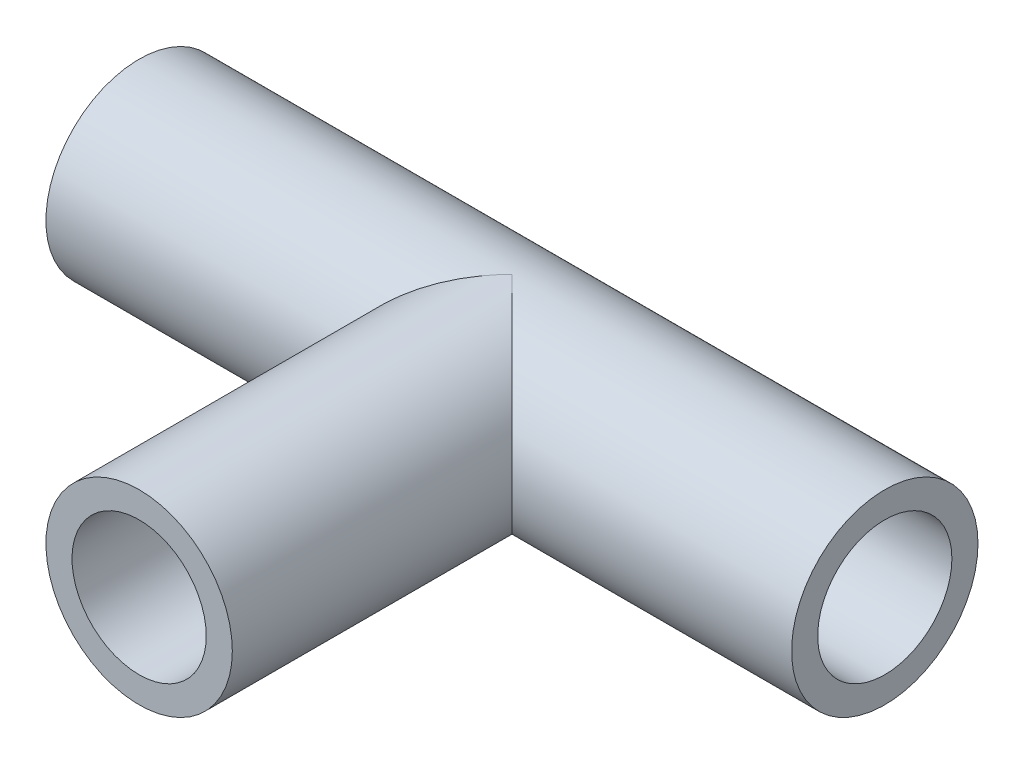
ISO-10303-21;
HEADER;
FILE_DESCRIPTION(('STEP AP214'),'2;1');
FILE_NAME('part.step','',(''),(''),'','','');
FILE_SCHEMA(('AUTOMOTIVE_DESIGN { 1 0 10303 214 1 1 1 1 }'));
ENDSEC;
DATA;
#1=APPLICATION_CONTEXT('core data for automotive mechanical design processes');
#2=APPLICATION_PROTOCOL_DEFINITION('international standard','automotive_design',2000,#1);
#3=PRODUCT_CONTEXT('',#1,'mechanical');
#4=PRODUCT('Part','Part','',(#3));
#5=PRODUCT_RELATED_PRODUCT_CATEGORY('part','',(#4));
#6=PRODUCT_DEFINITION_FORMATION('','',#4);
#7=PRODUCT_DEFINITION_CONTEXT('part definition',#1,'design');
#8=PRODUCT_DEFINITION('design','',#6,#7);
#9=PRODUCT_DEFINITION_SHAPE('','',#8);
#10=(LENGTH_UNIT() NAMED_UNIT(*) SI_UNIT(.MILLI.,.METRE.));
#11=(NAMED_UNIT(*) PLANE_ANGLE_UNIT() SI_UNIT($,.RADIAN.));
#12=(NAMED_UNIT(*) SI_UNIT($,.STERADIAN.) SOLID_ANGLE_UNIT());
#13=UNCERTAINTY_MEASURE_WITH_UNIT(LENGTH_MEASURE(1.E-05),#10,'distance_accuracy_value','');
#14=(GEOMETRIC_REPRESENTATION_CONTEXT(3) GLOBAL_UNCERTAINTY_ASSIGNED_CONTEXT((#13)) GLOBAL_UNIT_ASSIGNED_CONTEXT((#10,
#11,#12)) REPRESENTATION_CONTEXT('',''));
#15=CARTESIAN_POINT('',(0.,0.,0.));
#16=DIRECTION('',(0.,0.,1.));
#17=DIRECTION('',(1.,0.,0.));
#18=AXIS2_PLACEMENT_3D('',#15,#16,#17);
#19=CARTESIAN_POINT('',(0.,0.,0.));
#20=DIRECTION('',(1.,0.,0.));
#21=DIRECTION('',(0.,0.,-1.));
#22=AXIS2_PLACEMENT_3D('',#19,#20,#21);
#23=CYLINDRICAL_SURFACE('',#22,2.7);
#24=CARTESIAN_POINT('',(30.,0.,0.));
#25=DIRECTION('',(1.,0.,0.));
#26=DIRECTION('',(0.,0.,-1.));
#27=AXIS2_PLACEMENT_3D('',#24,#25,#26);
#28=CIRCLE('',#27,2.7);
#29=CARTESIAN_POINT('',(30.,0.,-2.7));
#30=VERTEX_POINT('',#29);
#31=EDGE_CURVE('E103',#30,#30,#28,.T.);
#32=ORIENTED_EDGE('',*,*,#31,.T.);
#33=EDGE_LOOP('',(#32));
#34=FACE_BOUND('',#33,.T.);
#35=CARTESIAN_POINT('',(0.,0.,0.));
#36=DIRECTION('',(1.,0.,0.));
#37=DIRECTION('',(0.,0.,-1.));
#38=AXIS2_PLACEMENT_3D('',#35,#36,#37);
#39=CIRCLE('',#38,2.7);
#40=CARTESIAN_POINT('',(0.,0.,-2.7));
#41=VERTEX_POINT('',#40);
#42=EDGE_CURVE('E96',#41,#41,#39,.T.);
#43=ORIENTED_EDGE('',*,*,#42,.F.);
#44=EDGE_LOOP('',(#43));
#45=FACE_BOUND('',#44,.T.);
#46=CARTESIAN_POINT('',(15.,0.,0.));
#47=DIRECTION('',(0.707106781186547,0.,-0.707106781186547));
#48=DIRECTION('',(0.707106781186547,0.,0.707106781186547));
#49=AXIS2_PLACEMENT_3D('',#46,#47,#48);
#50=ELLIPSE('',#49,3.81837661840736,2.7);
#51=CARTESIAN_POINT('',(15.,2.7,0.));
#52=VERTEX_POINT('',#51);
#53=CARTESIAN_POINT('',(15.,-2.7,0.));
#54=VERTEX_POINT('',#53);
#55=EDGE_CURVE('E12',#52,#54,#50,.T.);
#56=ORIENTED_EDGE('',*,*,#55,.F.);
#57=CARTESIAN_POINT('',(15.,0.,0.));
#58=DIRECTION('',(0.707106781186547,0.,0.707106781186547));
#59=DIRECTION('',(0.707106781186547,0.,-0.707106781186547));
#60=AXIS2_PLACEMENT_3D('',#57,#58,#59);
#61=ELLIPSE('',#60,3.81837661840736,2.7);
#62=EDGE_CURVE('E51',#54,#52,#61,.F.);
#63=ORIENTED_EDGE('',*,*,#62,.F.);
#64=EDGE_LOOP('',(#56,#63));
#65=FACE_BOUND('',#64,.T.);
#66=ADVANCED_FACE('F43',(#34,#45,#65),#23,.F.);
#67=CARTESIAN_POINT('',(30.,0.,0.));
#68=DIRECTION('',(-1.,0.,0.));
#69=DIRECTION('',(0.,0.,1.));
#70=AXIS2_PLACEMENT_3D('',#67,#68,#69);
#71=CYLINDRICAL_SURFACE('',#70,3.75);
#72=CARTESIAN_POINT('',(0.,0.,0.));
#73=DIRECTION('',(1.,0.,0.));
#74=DIRECTION('',(0.,0.,-1.));
#75=AXIS2_PLACEMENT_3D('',#72,#73,#74);
#76=CIRCLE('',#75,3.75);
#77=CARTESIAN_POINT('',(0.,0.,-3.75));
#78=VERTEX_POINT('',#77);
#79=EDGE_CURVE('E99',#78,#78,#76,.T.);
#80=ORIENTED_EDGE('',*,*,#79,.T.);
#81=EDGE_LOOP('',(#80));
#82=FACE_BOUND('',#81,.T.);
#83=CARTESIAN_POINT('',(30.,0.,0.));
#84=DIRECTION('',(1.,0.,0.));
#85=DIRECTION('',(0.,0.,-1.));
#86=AXIS2_PLACEMENT_3D('',#83,#84,#85);
#87=CIRCLE('',#86,3.75);
#88=CARTESIAN_POINT('',(30.,0.,-3.75));
#89=VERTEX_POINT('',#88);
#90=EDGE_CURVE('E69',#89,#89,#87,.T.);
#91=ORIENTED_EDGE('',*,*,#90,.F.);
#92=EDGE_LOOP('',(#91));
#93=FACE_BOUND('',#92,.T.);
#94=CARTESIAN_POINT('',(15.,0.,0.));
#95=DIRECTION('',(-0.707106781186547,0.,-0.707106781186547));
#96=DIRECTION('',(-0.707106781186547,0.,0.707106781186547));
#97=AXIS2_PLACEMENT_3D('',#94,#95,#96);
#98=ELLIPSE('',#97,5.30330085889911,3.75);
#99=CARTESIAN_POINT('',(15.,3.75,0.));
#100=VERTEX_POINT('',#99);
#101=CARTESIAN_POINT('',(15.,-3.75,0.));
#102=VERTEX_POINT('',#101);
#103=EDGE_CURVE('E106',#100,#102,#98,.F.);
#104=ORIENTED_EDGE('',*,*,#103,.F.);
#105=CARTESIAN_POINT('',(15.,0.,0.));
#106=DIRECTION('',(-0.707106781186547,0.,0.707106781186547));
#107=DIRECTION('',(-0.707106781186547,0.,-0.707106781186547));
#108=AXIS2_PLACEMENT_3D('',#105,#106,#107);
#109=ELLIPSE('',#108,5.30330085889911,3.75);
#110=EDGE_CURVE('E62',#102,#100,#109,.T.);
#111=ORIENTED_EDGE('',*,*,#110,.F.);
#112=EDGE_LOOP('',(#104,#111));
#113=FACE_BOUND('',#112,.T.);
#114=ADVANCED_FACE('F45',(#82,#93,#113),#71,.T.);
#115=CARTESIAN_POINT('',(30.,0.,0.));
#116=DIRECTION('',(1.,0.,0.));
#117=DIRECTION('',(0.,0.,-1.));
#118=AXIS2_PLACEMENT_3D('',#115,#116,#117);
#119=PLANE('',#118);
#120=ORIENTED_EDGE('',*,*,#31,.F.);
#121=EDGE_LOOP('',(#120));
#122=FACE_BOUND('',#121,.T.);
#123=ORIENTED_EDGE('',*,*,#90,.T.);
#124=EDGE_LOOP('',(#123));
#125=FACE_BOUND('',#124,.T.);
#126=ADVANCED_FACE('F76',(#122,#125),#119,.T.);
#127=CARTESIAN_POINT('',(0.,0.,0.));
#128=DIRECTION('',(1.,0.,0.));
#129=DIRECTION('',(0.,0.,-1.));
#130=AXIS2_PLACEMENT_3D('',#127,#128,#129);
#131=PLANE('',#130);
#132=ORIENTED_EDGE('',*,*,#42,.T.);
#133=EDGE_LOOP('',(#132));
#134=FACE_BOUND('',#133,.T.);
#135=ORIENTED_EDGE('',*,*,#79,.F.);
#136=EDGE_LOOP('',(#135));
#137=FACE_BOUND('',#136,.T.);
#138=ADVANCED_FACE('F85',(#134,#137),#131,.F.);
#139=CARTESIAN_POINT('',(15.,0.,15.));
#140=DIRECTION('',(0.,0.,-1.));
#141=DIRECTION('',(-1.,0.,0.));
#142=AXIS2_PLACEMENT_3D('',#139,#140,#141);
#143=CYLINDRICAL_SURFACE('',#142,3.75);
#144=CARTESIAN_POINT('',(15.,0.,15.));
#145=DIRECTION('',(0.,0.,1.));
#146=DIRECTION('',(1.,0.,0.));
#147=AXIS2_PLACEMENT_3D('',#144,#145,#146);
#148=CIRCLE('',#147,3.75);
#149=CARTESIAN_POINT('',(18.75,0.,15.));
#150=VERTEX_POINT('',#149);
#151=EDGE_CURVE('E110',#150,#150,#148,.T.);
#152=ORIENTED_EDGE('',*,*,#151,.F.);
#153=EDGE_LOOP('',(#152));
#154=FACE_BOUND('',#153,.T.);
#155=ORIENTED_EDGE('',*,*,#110,.T.);
#156=ORIENTED_EDGE('',*,*,#103,.T.);
#157=EDGE_LOOP('',(#155,#156));
#158=FACE_BOUND('',#157,.T.);
#159=ADVANCED_FACE('F82',(#154,#158),#143,.T.);
#160=CARTESIAN_POINT('',(15.,0.,15.));
#161=DIRECTION('',(0.,0.,-1.));
#162=DIRECTION('',(-1.,0.,0.));
#163=AXIS2_PLACEMENT_3D('',#160,#161,#162);
#164=CYLINDRICAL_SURFACE('',#163,2.7);
#165=CARTESIAN_POINT('',(15.,0.,15.));
#166=DIRECTION('',(0.,0.,1.));
#167=DIRECTION('',(1.,0.,0.));
#168=AXIS2_PLACEMENT_3D('',#165,#166,#167);
#169=CIRCLE('',#168,2.7);
#170=CARTESIAN_POINT('',(17.7,0.,15.));
#171=VERTEX_POINT('',#170);
#172=EDGE_CURVE('E113',#171,#171,#169,.T.);
#173=ORIENTED_EDGE('',*,*,#172,.T.);
#174=EDGE_LOOP('',(#173));
#175=FACE_BOUND('',#174,.T.);
#176=ORIENTED_EDGE('',*,*,#55,.T.);
#177=ORIENTED_EDGE('',*,*,#62,.T.);
#178=EDGE_LOOP('',(#176,#177));
#179=FACE_BOUND('',#178,.T.);
#180=ADVANCED_FACE('F67',(#175,#179),#164,.F.);
#181=CARTESIAN_POINT('',(0.,0.,15.));
#182=DIRECTION('',(0.,0.,1.));
#183=DIRECTION('',(1.,0.,0.));
#184=AXIS2_PLACEMENT_3D('',#181,#182,#183);
#185=PLANE('',#184);
#186=ORIENTED_EDGE('',*,*,#151,.T.);
#187=EDGE_LOOP('',(#186));
#188=FACE_BOUND('',#187,.T.);
#189=ORIENTED_EDGE('',*,*,#172,.F.);
#190=EDGE_LOOP('',(#189));
#191=FACE_BOUND('',#190,.T.);
#192=ADVANCED_FACE('F118',(#188,#191),#185,.T.);
#193=CLOSED_SHELL('',(#66,#114,#126,#138,#159,#180,#192));
#194=MANIFOLD_SOLID_BREP('B2',#193);
#195=ADVANCED_BREP_SHAPE_REPRESENTATION('',(#18,#194),#14);
#196=SHAPE_DEFINITION_REPRESENTATION(#9,#195);
ENDSEC;
END-ISO-10303-21;
